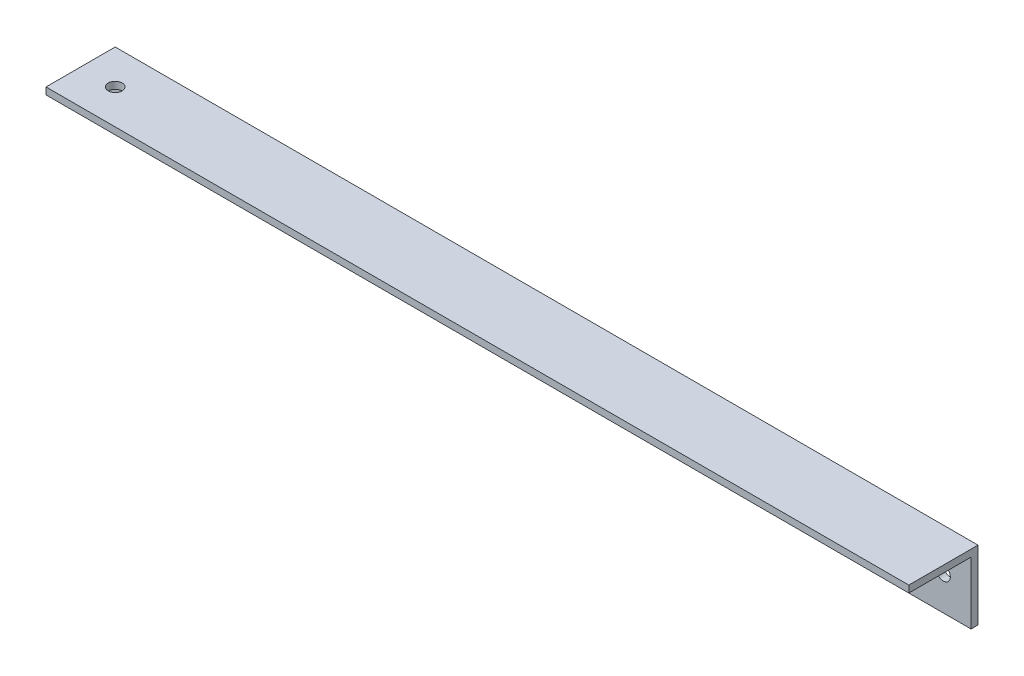
ISO-10303-21;
HEADER;
FILE_DESCRIPTION(('STEP AP214'),'2;1');
FILE_NAME('part.step','',(''),(''),'','','');
FILE_SCHEMA(('AUTOMOTIVE_DESIGN { 1 0 10303 214 1 1 1 1 }'));
ENDSEC;
DATA;
#1=APPLICATION_CONTEXT('core data for automotive mechanical design processes');
#2=APPLICATION_PROTOCOL_DEFINITION('international standard','automotive_design',2000,#1);
#3=PRODUCT_CONTEXT('',#1,'mechanical');
#4=PRODUCT('Part','Part','',(#3));
#5=PRODUCT_RELATED_PRODUCT_CATEGORY('part','',(#4));
#6=PRODUCT_DEFINITION_FORMATION('','',#4);
#7=PRODUCT_DEFINITION_CONTEXT('part definition',#1,'design');
#8=PRODUCT_DEFINITION('design','',#6,#7);
#9=PRODUCT_DEFINITION_SHAPE('','',#8);
#10=(LENGTH_UNIT() NAMED_UNIT(*) SI_UNIT(.MILLI.,.METRE.));
#11=(NAMED_UNIT(*) PLANE_ANGLE_UNIT() SI_UNIT($,.RADIAN.));
#12=(NAMED_UNIT(*) SI_UNIT($,.STERADIAN.) SOLID_ANGLE_UNIT());
#13=UNCERTAINTY_MEASURE_WITH_UNIT(LENGTH_MEASURE(1.E-05),#10,'distance_accuracy_value','');
#14=(GEOMETRIC_REPRESENTATION_CONTEXT(3) GLOBAL_UNCERTAINTY_ASSIGNED_CONTEXT((#13)) GLOBAL_UNIT_ASSIGNED_CONTEXT((#10,
#11,#12)) REPRESENTATION_CONTEXT('',''));
#15=CARTESIAN_POINT('',(0.,0.,0.));
#16=DIRECTION('',(0.,0.,1.));
#17=DIRECTION('',(1.,0.,0.));
#18=AXIS2_PLACEMENT_3D('',#15,#16,#17);
#19=CARTESIAN_POINT('',(-79.9290548008884,2.04473684210527,1.5));
#20=DIRECTION('',(0.,0.,1.));
#21=DIRECTION('',(1.,0.,0.));
#22=AXIS2_PLACEMENT_3D('',#19,#20,#21);
#23=PLANE('',#22);
#24=DIRECTION('',(1.,0.,0.));
#25=VECTOR('',#24,1.);
#26=CARTESIAN_POINT('',(107.070945199112,15.5447368421053,1.5));
#27=LINE('',#26,#25);
#28=CARTESIAN_POINT('',(-79.9290548008884,15.5447368421052,1.5));
#29=VERTEX_POINT('',#28);
#30=CARTESIAN_POINT('',(107.070945199112,15.5447368421053,1.5));
#31=VERTEX_POINT('',#30);
#32=EDGE_CURVE('E48',#29,#31,#27,.T.);
#33=ORIENTED_EDGE('',*,*,#32,.F.);
#34=DIRECTION('',(0.,-1.,0.));
#35=VECTOR('',#34,1.);
#36=CARTESIAN_POINT('',(-79.9290548008884,17.0447368421053,1.5));
#37=LINE('',#36,#35);
#38=CARTESIAN_POINT('',(-79.9290548008884,2.04473684210527,1.5));
#39=VERTEX_POINT('',#38);
#40=EDGE_CURVE('E86',#29,#39,#37,.T.);
#41=ORIENTED_EDGE('',*,*,#40,.T.);
#42=DIRECTION('',(1.,0.,0.));
#43=VECTOR('',#42,1.);
#44=CARTESIAN_POINT('',(-79.9290548008884,2.04473684210527,1.5));
#45=LINE('',#44,#43);
#46=CARTESIAN_POINT('',(107.070945199112,2.04473684210527,1.5));
#47=VERTEX_POINT('',#46);
#48=EDGE_CURVE('E54',#39,#47,#45,.T.);
#49=ORIENTED_EDGE('',*,*,#48,.T.);
#50=DIRECTION('',(0.,1.,0.));
#51=VECTOR('',#50,1.);
#52=CARTESIAN_POINT('',(107.070945199112,17.0447368421053,1.5));
#53=LINE('',#52,#51);
#54=EDGE_CURVE('E97',#47,#31,#53,.T.);
#55=ORIENTED_EDGE('',*,*,#54,.T.);
#56=EDGE_LOOP('',(#33,#41,#49,#55));
#57=FACE_BOUND('',#56,.T.);
#58=CARTESIAN_POINT('',(-31.4290548008884,8.04473684210527,1.5));
#59=DIRECTION('',(0.,0.,1.));
#60=DIRECTION('',(1.,0.,0.));
#61=AXIS2_PLACEMENT_3D('',#58,#59,#60);
#62=CIRCLE('',#61,1.49999999999999);
#63=CARTESIAN_POINT('',(-29.9290548008884,8.04473684210527,1.5));
#64=VERTEX_POINT('',#63);
#65=EDGE_CURVE('E156',#64,#64,#62,.T.);
#66=ORIENTED_EDGE('',*,*,#65,.F.);
#67=EDGE_LOOP('',(#66));
#68=FACE_BOUND('',#67,.T.);
#69=CARTESIAN_POINT('',(101.070945199112,9.54473684210527,1.5));
#70=DIRECTION('',(0.,0.,1.));
#71=DIRECTION('',(1.,0.,0.));
#72=AXIS2_PLACEMENT_3D('',#69,#70,#71);
#73=CIRCLE('',#72,1.5);
#74=CARTESIAN_POINT('',(102.570945199112,9.54473684210527,1.5));
#75=VERTEX_POINT('',#74);
#76=EDGE_CURVE('E102',#75,#75,#73,.T.);
#77=ORIENTED_EDGE('',*,*,#76,.F.);
#78=EDGE_LOOP('',(#77));
#79=FACE_BOUND('',#78,.T.);
#80=CARTESIAN_POINT('',(-72.4290548008884,8.04473684210527,1.5));
#81=DIRECTION('',(0.,0.,1.));
#82=DIRECTION('',(1.,0.,0.));
#83=AXIS2_PLACEMENT_3D('',#80,#81,#82);
#84=CIRCLE('',#83,1.5);
#85=CARTESIAN_POINT('',(-70.9290548008884,8.04473684210527,1.5));
#86=VERTEX_POINT('',#85);
#87=EDGE_CURVE('E162',#86,#86,#84,.T.);
#88=ORIENTED_EDGE('',*,*,#87,.F.);
#89=EDGE_LOOP('',(#88));
#90=FACE_BOUND('',#89,.T.);
#91=CARTESIAN_POINT('',(68.5709451991116,8.04473684210527,1.5));
#92=DIRECTION('',(0.,0.,1.));
#93=DIRECTION('',(1.,0.,0.));
#94=AXIS2_PLACEMENT_3D('',#91,#92,#93);
#95=CIRCLE('',#94,1.49999999999997);
#96=CARTESIAN_POINT('',(70.0709451991116,8.04473684210527,1.5));
#97=VERTEX_POINT('',#96);
#98=EDGE_CURVE('E150',#97,#97,#95,.T.);
#99=ORIENTED_EDGE('',*,*,#98,.F.);
#100=EDGE_LOOP('',(#99));
#101=FACE_BOUND('',#100,.T.);
#102=ADVANCED_FACE('F31',(#57,#68,#79,#90,#101),#23,.T.);
#103=CARTESIAN_POINT('',(-79.9290548008884,2.04473684210527,0.));
#104=DIRECTION('',(0.,0.,1.));
#105=DIRECTION('',(1.,0.,0.));
#106=AXIS2_PLACEMENT_3D('',#103,#104,#105);
#107=PLANE('',#106);
#108=CARTESIAN_POINT('',(-31.4290548008884,8.04473684210527,0.));
#109=DIRECTION('',(0.,0.,1.));
#110=DIRECTION('',(1.,0.,0.));
#111=AXIS2_PLACEMENT_3D('',#108,#109,#110);
#112=CIRCLE('',#111,1.49999999999999);
#113=CARTESIAN_POINT('',(-29.9290548008884,8.04473684210527,0.));
#114=VERTEX_POINT('',#113);
#115=EDGE_CURVE('E153',#114,#114,#112,.T.);
#116=ORIENTED_EDGE('',*,*,#115,.T.);
#117=EDGE_LOOP('',(#116));
#118=FACE_BOUND('',#117,.T.);
#119=CARTESIAN_POINT('',(101.070945199112,9.54473684210527,0.));
#120=DIRECTION('',(0.,0.,1.));
#121=DIRECTION('',(1.,0.,0.));
#122=AXIS2_PLACEMENT_3D('',#119,#120,#121);
#123=CIRCLE('',#122,1.5);
#124=CARTESIAN_POINT('',(102.570945199112,9.54473684210527,0.));
#125=VERTEX_POINT('',#124);
#126=EDGE_CURVE('E106',#125,#125,#123,.T.);
#127=ORIENTED_EDGE('',*,*,#126,.T.);
#128=EDGE_LOOP('',(#127));
#129=FACE_BOUND('',#128,.T.);
#130=DIRECTION('',(0.,-1.,0.));
#131=VECTOR('',#130,1.);
#132=CARTESIAN_POINT('',(-79.9290548008884,17.0447368421053,0.));
#133=LINE('',#132,#131);
#134=CARTESIAN_POINT('',(-79.9290548008884,17.0447368421053,0.));
#135=VERTEX_POINT('',#134);
#136=CARTESIAN_POINT('',(-79.9290548008884,2.04473684210527,0.));
#137=VERTEX_POINT('',#136);
#138=EDGE_CURVE('E93',#135,#137,#133,.T.);
#139=ORIENTED_EDGE('',*,*,#138,.F.);
#140=DIRECTION('',(-1.,0.,0.));
#141=VECTOR('',#140,1.);
#142=CARTESIAN_POINT('',(-79.9290548008884,17.0447368421053,0.));
#143=LINE('',#142,#141);
#144=CARTESIAN_POINT('',(107.070945199112,17.0447368421053,0.));
#145=VERTEX_POINT('',#144);
#146=EDGE_CURVE('E74',#145,#135,#143,.T.);
#147=ORIENTED_EDGE('',*,*,#146,.F.);
#148=DIRECTION('',(0.,1.,0.));
#149=VECTOR('',#148,1.);
#150=CARTESIAN_POINT('',(107.070945199112,17.0447368421053,0.));
#151=LINE('',#150,#149);
#152=CARTESIAN_POINT('',(107.070945199112,2.04473684210527,0.));
#153=VERTEX_POINT('',#152);
#154=EDGE_CURVE('E87',#153,#145,#151,.T.);
#155=ORIENTED_EDGE('',*,*,#154,.F.);
#156=DIRECTION('',(1.,0.,0.));
#157=VECTOR('',#156,1.);
#158=CARTESIAN_POINT('',(-79.9290548008884,2.04473684210527,0.));
#159=LINE('',#158,#157);
#160=EDGE_CURVE('E101',#137,#153,#159,.T.);
#161=ORIENTED_EDGE('',*,*,#160,.F.);
#162=EDGE_LOOP('',(#139,#147,#155,#161));
#163=FACE_BOUND('',#162,.T.);
#164=CARTESIAN_POINT('',(-72.4290548008884,8.04473684210527,0.));
#165=DIRECTION('',(0.,0.,1.));
#166=DIRECTION('',(1.,0.,0.));
#167=AXIS2_PLACEMENT_3D('',#164,#165,#166);
#168=CIRCLE('',#167,1.5);
#169=CARTESIAN_POINT('',(-70.9290548008884,8.04473684210527,0.));
#170=VERTEX_POINT('',#169);
#171=EDGE_CURVE('E159',#170,#170,#168,.T.);
#172=ORIENTED_EDGE('',*,*,#171,.T.);
#173=EDGE_LOOP('',(#172));
#174=FACE_BOUND('',#173,.T.);
#175=CARTESIAN_POINT('',(68.5709451991116,8.04473684210527,0.));
#176=DIRECTION('',(0.,0.,1.));
#177=DIRECTION('',(1.,0.,0.));
#178=AXIS2_PLACEMENT_3D('',#175,#176,#177);
#179=CIRCLE('',#178,1.49999999999997);
#180=CARTESIAN_POINT('',(70.0709451991116,8.04473684210527,0.));
#181=VERTEX_POINT('',#180);
#182=EDGE_CURVE('E141',#181,#181,#179,.T.);
#183=ORIENTED_EDGE('',*,*,#182,.T.);
#184=EDGE_LOOP('',(#183));
#185=FACE_BOUND('',#184,.T.);
#186=ADVANCED_FACE('F99',(#118,#129,#163,#174,#185),#107,.F.);
#187=CARTESIAN_POINT('',(-79.9290548008884,17.0447368421053,1.5));
#188=DIRECTION('',(1.,0.,0.));
#189=DIRECTION('',(0.,0.,-1.));
#190=AXIS2_PLACEMENT_3D('',#187,#188,#189);
#191=PLANE('',#190);
#192=ORIENTED_EDGE('',*,*,#138,.T.);
#193=DIRECTION('',(0.,0.,-1.));
#194=VECTOR('',#193,1.);
#195=CARTESIAN_POINT('',(-79.9290548008884,2.04473684210527,1.5));
#196=LINE('',#195,#194);
#197=EDGE_CURVE('E11',#39,#137,#196,.T.);
#198=ORIENTED_EDGE('',*,*,#197,.F.);
#199=ORIENTED_EDGE('',*,*,#40,.F.);
#200=DIRECTION('',(0.,0.,-1.));
#201=VECTOR('',#200,1.);
#202=CARTESIAN_POINT('',(-79.9290548008884,15.5447368421052,15.));
#203=LINE('',#202,#201);
#204=CARTESIAN_POINT('',(-79.9290548008884,15.5447368421052,15.));
#205=VERTEX_POINT('',#204);
#206=EDGE_CURVE('E134',#205,#29,#203,.T.);
#207=ORIENTED_EDGE('',*,*,#206,.F.);
#208=DIRECTION('',(0.,-1.,0.));
#209=VECTOR('',#208,1.);
#210=CARTESIAN_POINT('',(-79.9290548008884,17.0447368421053,15.));
#211=LINE('',#210,#209);
#212=CARTESIAN_POINT('',(-79.9290548008884,17.0447368421053,15.));
#213=VERTEX_POINT('',#212);
#214=EDGE_CURVE('E96',#213,#205,#211,.T.);
#215=ORIENTED_EDGE('',*,*,#214,.F.);
#216=DIRECTION('',(0.,0.,-1.));
#217=VECTOR('',#216,1.);
#218=CARTESIAN_POINT('',(-79.9290548008884,17.0447368421053,1.5));
#219=LINE('',#218,#217);
#220=EDGE_CURVE('E79',#213,#135,#219,.T.);
#221=ORIENTED_EDGE('',*,*,#220,.T.);
#222=EDGE_LOOP('',(#192,#198,#199,#207,#215,#221));
#223=FACE_BOUND('',#222,.T.);
#224=ADVANCED_FACE('F33',(#223),#191,.F.);
#225=CARTESIAN_POINT('',(-79.9290548008884,2.04473684210527,1.5));
#226=DIRECTION('',(0.,1.,0.));
#227=DIRECTION('',(0.,0.,1.));
#228=AXIS2_PLACEMENT_3D('',#225,#226,#227);
#229=PLANE('',#228);
#230=ORIENTED_EDGE('',*,*,#160,.T.);
#231=DIRECTION('',(0.,0.,-1.));
#232=VECTOR('',#231,1.);
#233=CARTESIAN_POINT('',(107.070945199112,2.04473684210527,1.5));
#234=LINE('',#233,#232);
#235=EDGE_CURVE('E40',#47,#153,#234,.T.);
#236=ORIENTED_EDGE('',*,*,#235,.F.);
#237=ORIENTED_EDGE('',*,*,#48,.F.);
#238=ORIENTED_EDGE('',*,*,#197,.T.);
#239=EDGE_LOOP('',(#230,#236,#237,#238));
#240=FACE_BOUND('',#239,.T.);
#241=ADVANCED_FACE('F196',(#240),#229,.F.);
#242=CARTESIAN_POINT('',(107.070945199112,17.0447368421053,1.5));
#243=DIRECTION('',(-1.,0.,0.));
#244=DIRECTION('',(0.,0.,1.));
#245=AXIS2_PLACEMENT_3D('',#242,#243,#244);
#246=PLANE('',#245);
#247=ORIENTED_EDGE('',*,*,#154,.T.);
#248=DIRECTION('',(0.,0.,-1.));
#249=VECTOR('',#248,1.);
#250=CARTESIAN_POINT('',(107.070945199112,17.0447368421053,1.5));
#251=LINE('',#250,#249);
#252=CARTESIAN_POINT('',(107.070945199112,17.0447368421053,15.));
#253=VERTEX_POINT('',#252);
#254=EDGE_CURVE('E82',#253,#145,#251,.T.);
#255=ORIENTED_EDGE('',*,*,#254,.F.);
#256=DIRECTION('',(0.,1.,0.));
#257=VECTOR('',#256,1.);
#258=CARTESIAN_POINT('',(107.070945199112,17.0447368421053,15.));
#259=LINE('',#258,#257);
#260=CARTESIAN_POINT('',(107.070945199112,15.5447368421053,15.));
#261=VERTEX_POINT('',#260);
#262=EDGE_CURVE('E135',#261,#253,#259,.T.);
#263=ORIENTED_EDGE('',*,*,#262,.F.);
#264=DIRECTION('',(0.,0.,-1.));
#265=VECTOR('',#264,1.);
#266=CARTESIAN_POINT('',(107.070945199112,15.5447368421053,15.));
#267=LINE('',#266,#265);
#268=EDGE_CURVE('E132',#261,#31,#267,.T.);
#269=ORIENTED_EDGE('',*,*,#268,.T.);
#270=ORIENTED_EDGE('',*,*,#54,.F.);
#271=ORIENTED_EDGE('',*,*,#235,.T.);
#272=EDGE_LOOP('',(#247,#255,#263,#269,#270,#271));
#273=FACE_BOUND('',#272,.T.);
#274=ADVANCED_FACE('F137',(#273),#246,.F.);
#275=CARTESIAN_POINT('',(-79.9290548008884,17.0447368421053,1.5));
#276=DIRECTION('',(0.,-1.,0.));
#277=DIRECTION('',(0.,0.,-1.));
#278=AXIS2_PLACEMENT_3D('',#275,#276,#277);
#279=PLANE('',#278);
#280=CARTESIAN_POINT('',(-72.4290548008884,17.0447368421053,7.5));
#281=DIRECTION('',(0.,-1.,0.));
#282=DIRECTION('',(0.,0.,-1.));
#283=AXIS2_PLACEMENT_3D('',#280,#281,#282);
#284=CIRCLE('',#283,1.5);
#285=CARTESIAN_POINT('',(-72.4290548008884,17.0447368421053,6.));
#286=VERTEX_POINT('',#285);
#287=EDGE_CURVE('E136',#286,#286,#284,.T.);
#288=ORIENTED_EDGE('',*,*,#287,.T.);
#289=EDGE_LOOP('',(#288));
#290=FACE_BOUND('',#289,.T.);
#291=ORIENTED_EDGE('',*,*,#146,.T.);
#292=ORIENTED_EDGE('',*,*,#220,.F.);
#293=DIRECTION('',(-1.,0.,0.));
#294=VECTOR('',#293,1.);
#295=CARTESIAN_POINT('',(107.070945199112,17.0447368421053,15.));
#296=LINE('',#295,#294);
#297=EDGE_CURVE('E203',#253,#213,#296,.T.);
#298=ORIENTED_EDGE('',*,*,#297,.F.);
#299=ORIENTED_EDGE('',*,*,#254,.T.);
#300=EDGE_LOOP('',(#291,#292,#298,#299));
#301=FACE_BOUND('',#300,.T.);
#302=ADVANCED_FACE('F76',(#290,#301),#279,.F.);
#303=CARTESIAN_POINT('',(101.070945199112,9.54473684210527,1.5));
#304=DIRECTION('',(0.,0.,-1.));
#305=DIRECTION('',(-1.,0.,0.));
#306=AXIS2_PLACEMENT_3D('',#303,#304,#305);
#307=CYLINDRICAL_SURFACE('',#306,1.5);
#308=ORIENTED_EDGE('',*,*,#76,.T.);
#309=EDGE_LOOP('',(#308));
#310=FACE_BOUND('',#309,.T.);
#311=ORIENTED_EDGE('',*,*,#126,.F.);
#312=EDGE_LOOP('',(#311));
#313=FACE_BOUND('',#312,.T.);
#314=ADVANCED_FACE('F172',(#310,#313),#307,.F.);
#315=CARTESIAN_POINT('',(-72.4290548008884,8.04473684210527,1.5));
#316=DIRECTION('',(0.,0.,-1.));
#317=DIRECTION('',(-1.,0.,0.));
#318=AXIS2_PLACEMENT_3D('',#315,#316,#317);
#319=CYLINDRICAL_SURFACE('',#318,1.5);
#320=ORIENTED_EDGE('',*,*,#87,.T.);
#321=EDGE_LOOP('',(#320));
#322=FACE_BOUND('',#321,.T.);
#323=ORIENTED_EDGE('',*,*,#171,.F.);
#324=EDGE_LOOP('',(#323));
#325=FACE_BOUND('',#324,.T.);
#326=ADVANCED_FACE('F169',(#322,#325),#319,.F.);
#327=CARTESIAN_POINT('',(-31.4290548008884,8.04473684210527,1.5));
#328=DIRECTION('',(0.,0.,-1.));
#329=DIRECTION('',(-1.,0.,0.));
#330=AXIS2_PLACEMENT_3D('',#327,#328,#329);
#331=CYLINDRICAL_SURFACE('',#330,1.49999999999999);
#332=ORIENTED_EDGE('',*,*,#65,.T.);
#333=EDGE_LOOP('',(#332));
#334=FACE_BOUND('',#333,.T.);
#335=ORIENTED_EDGE('',*,*,#115,.F.);
#336=EDGE_LOOP('',(#335));
#337=FACE_BOUND('',#336,.T.);
#338=ADVANCED_FACE('F171',(#334,#337),#331,.F.);
#339=CARTESIAN_POINT('',(68.5709451991116,8.04473684210527,1.5));
#340=DIRECTION('',(0.,0.,-1.));
#341=DIRECTION('',(-1.,0.,0.));
#342=AXIS2_PLACEMENT_3D('',#339,#340,#341);
#343=CYLINDRICAL_SURFACE('',#342,1.49999999999997);
#344=ORIENTED_EDGE('',*,*,#98,.T.);
#345=EDGE_LOOP('',(#344));
#346=FACE_BOUND('',#345,.T.);
#347=ORIENTED_EDGE('',*,*,#182,.F.);
#348=EDGE_LOOP('',(#347));
#349=FACE_BOUND('',#348,.T.);
#350=ADVANCED_FACE('F179',(#346,#349),#343,.F.);
#351=CARTESIAN_POINT('',(107.070945199112,15.5447368421053,15.));
#352=DIRECTION('',(0.,1.,0.));
#353=DIRECTION('',(-1.,0.,0.));
#354=AXIS2_PLACEMENT_3D('',#351,#352,#353);
#355=PLANE('',#354);
#356=CARTESIAN_POINT('',(-72.4290548008884,15.5447368421052,7.5));
#357=DIRECTION('',(0.,-1.,0.));
#358=DIRECTION('',(1.,0.,0.));
#359=AXIS2_PLACEMENT_3D('',#356,#357,#358);
#360=CIRCLE('',#359,1.5);
#361=CARTESIAN_POINT('',(-70.9290548008884,15.5447368421052,7.5));
#362=VERTEX_POINT('',#361);
#363=EDGE_CURVE('E215',#362,#362,#360,.T.);
#364=ORIENTED_EDGE('',*,*,#363,.F.);
#365=EDGE_LOOP('',(#364));
#366=FACE_BOUND('',#365,.T.);
#367=ORIENTED_EDGE('',*,*,#32,.T.);
#368=ORIENTED_EDGE('',*,*,#268,.F.);
#369=DIRECTION('',(1.,0.,0.));
#370=VECTOR('',#369,1.);
#371=CARTESIAN_POINT('',(107.070945199112,15.5447368421053,15.));
#372=LINE('',#371,#370);
#373=EDGE_CURVE('E139',#205,#261,#372,.T.);
#374=ORIENTED_EDGE('',*,*,#373,.F.);
#375=ORIENTED_EDGE('',*,*,#206,.T.);
#376=EDGE_LOOP('',(#367,#368,#374,#375));
#377=FACE_BOUND('',#376,.T.);
#378=ADVANCED_FACE('F130',(#366,#377),#355,.F.);
#379=CARTESIAN_POINT('',(107.070945199112,15.5447368421053,15.));
#380=DIRECTION('',(0.,0.,-1.));
#381=DIRECTION('',(-1.,0.,0.));
#382=AXIS2_PLACEMENT_3D('',#379,#380,#381);
#383=PLANE('',#382);
#384=ORIENTED_EDGE('',*,*,#262,.T.);
#385=ORIENTED_EDGE('',*,*,#297,.T.);
#386=ORIENTED_EDGE('',*,*,#214,.T.);
#387=ORIENTED_EDGE('',*,*,#373,.T.);
#388=EDGE_LOOP('',(#384,#385,#386,#387));
#389=FACE_BOUND('',#388,.T.);
#390=ADVANCED_FACE('F206',(#389),#383,.F.);
#391=CARTESIAN_POINT('',(-72.4290548008884,25.5447368421052,7.5));
#392=DIRECTION('',(0.,-1.,0.));
#393=DIRECTION('',(1.,0.,0.));
#394=AXIS2_PLACEMENT_3D('',#391,#392,#393);
#395=CYLINDRICAL_SURFACE('',#394,1.5);
#396=ORIENTED_EDGE('',*,*,#363,.T.);
#397=EDGE_LOOP('',(#396));
#398=FACE_BOUND('',#397,.T.);
#399=ORIENTED_EDGE('',*,*,#287,.F.);
#400=EDGE_LOOP('',(#399));
#401=FACE_BOUND('',#400,.T.);
#402=ADVANCED_FACE('F219',(#398,#401),#395,.F.);
#403=CLOSED_SHELL('',(#102,#186,#224,#241,#274,#302,#314,#326,#338,#350,#378,#390,#402));
#404=MANIFOLD_SOLID_BREP('B2',#403);
#405=ADVANCED_BREP_SHAPE_REPRESENTATION('',(#18,#404),#14);
#406=SHAPE_DEFINITION_REPRESENTATION(#9,#405);
ENDSEC;
END-ISO-10303-21;
